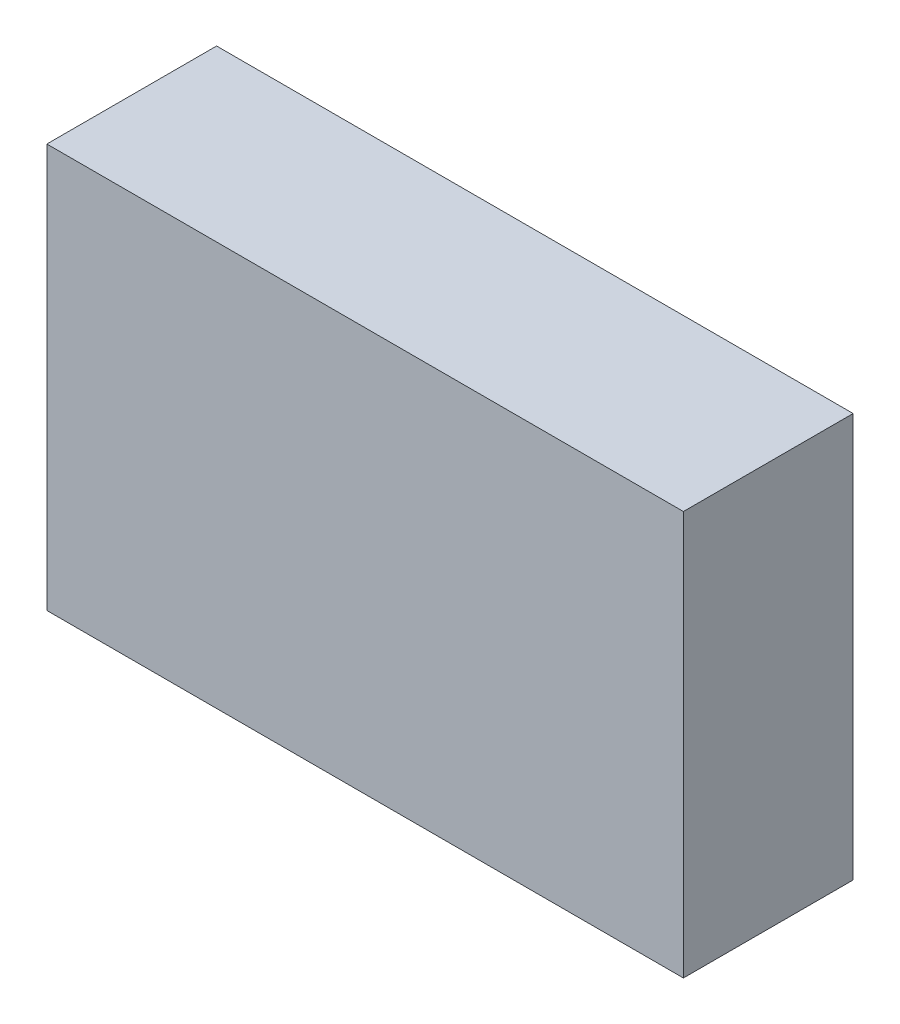
ISO-10303-21;
HEADER;
FILE_DESCRIPTION(('STEP AP214'),'2;1');
FILE_NAME('part.step','',(''),(''),'','','');
FILE_SCHEMA(('AUTOMOTIVE_DESIGN { 1 0 10303 214 1 1 1 1 }'));
ENDSEC;
DATA;
#1=APPLICATION_CONTEXT('core data for automotive mechanical design processes');
#2=APPLICATION_PROTOCOL_DEFINITION('international standard','automotive_design',2000,#1);
#3=PRODUCT_CONTEXT('',#1,'mechanical');
#4=PRODUCT('Part','Part','',(#3));
#5=PRODUCT_RELATED_PRODUCT_CATEGORY('part','',(#4));
#6=PRODUCT_DEFINITION_FORMATION('','',#4);
#7=PRODUCT_DEFINITION_CONTEXT('part definition',#1,'design');
#8=PRODUCT_DEFINITION('design','',#6,#7);
#9=PRODUCT_DEFINITION_SHAPE('','',#8);
#10=(LENGTH_UNIT() NAMED_UNIT(*) SI_UNIT(.MILLI.,.METRE.));
#11=(NAMED_UNIT(*) PLANE_ANGLE_UNIT() SI_UNIT($,.RADIAN.));
#12=(NAMED_UNIT(*) SI_UNIT($,.STERADIAN.) SOLID_ANGLE_UNIT());
#13=UNCERTAINTY_MEASURE_WITH_UNIT(LENGTH_MEASURE(1.E-05),#10,'distance_accuracy_value','');
#14=(GEOMETRIC_REPRESENTATION_CONTEXT(3) GLOBAL_UNCERTAINTY_ASSIGNED_CONTEXT((#13)) GLOBAL_UNIT_ASSIGNED_CONTEXT((#10,
#11,#12)) REPRESENTATION_CONTEXT('',''));
#15=CARTESIAN_POINT('',(0.,0.,0.));
#16=DIRECTION('',(0.,0.,1.));
#17=DIRECTION('',(1.,0.,0.));
#18=AXIS2_PLACEMENT_3D('',#15,#16,#17);
#19=CARTESIAN_POINT('',(37.5,23.8,20.));
#20=DIRECTION('',(-1.,0.,0.));
#21=DIRECTION('',(0.,0.,1.));
#22=AXIS2_PLACEMENT_3D('',#19,#20,#21);
#23=PLANE('',#22);
#24=DIRECTION('',(0.,1.,0.));
#25=VECTOR('',#24,1.);
#26=CARTESIAN_POINT('',(37.5,23.8,0.));
#27=LINE('',#26,#25);
#28=CARTESIAN_POINT('',(37.5,-23.8,0.));
#29=VERTEX_POINT('',#28);
#30=CARTESIAN_POINT('',(37.5,23.8,0.));
#31=VERTEX_POINT('',#30);
#32=EDGE_CURVE('E104',#29,#31,#27,.T.);
#33=ORIENTED_EDGE('',*,*,#32,.T.);
#34=DIRECTION('',(0.,0.,-1.));
#35=VECTOR('',#34,1.);
#36=CARTESIAN_POINT('',(37.5,23.8,20.));
#37=LINE('',#36,#35);
#38=CARTESIAN_POINT('',(37.5,23.8,20.));
#39=VERTEX_POINT('',#38);
#40=EDGE_CURVE('E11',#39,#31,#37,.T.);
#41=ORIENTED_EDGE('',*,*,#40,.F.);
#42=DIRECTION('',(0.,1.,0.));
#43=VECTOR('',#42,1.);
#44=CARTESIAN_POINT('',(37.5,23.8,20.));
#45=LINE('',#44,#43);
#46=CARTESIAN_POINT('',(37.5,-23.8,20.));
#47=VERTEX_POINT('',#46);
#48=EDGE_CURVE('E92',#47,#39,#45,.T.);
#49=ORIENTED_EDGE('',*,*,#48,.F.);
#50=DIRECTION('',(0.,0.,-1.));
#51=VECTOR('',#50,1.);
#52=CARTESIAN_POINT('',(37.5,-23.8,20.));
#53=LINE('',#52,#51);
#54=EDGE_CURVE('E100',#47,#29,#53,.T.);
#55=ORIENTED_EDGE('',*,*,#54,.T.);
#56=EDGE_LOOP('',(#33,#41,#49,#55));
#57=FACE_BOUND('',#56,.T.);
#58=ADVANCED_FACE('F41',(#57),#23,.F.);
#59=CARTESIAN_POINT('',(-37.5,23.8,20.));
#60=DIRECTION('',(0.,-1.,0.));
#61=DIRECTION('',(0.,0.,-1.));
#62=AXIS2_PLACEMENT_3D('',#59,#60,#61);
#63=PLANE('',#62);
#64=DIRECTION('',(-1.,0.,0.));
#65=VECTOR('',#64,1.);
#66=CARTESIAN_POINT('',(-37.5,23.8,0.));
#67=LINE('',#66,#65);
#68=CARTESIAN_POINT('',(-37.5,23.8,0.));
#69=VERTEX_POINT('',#68);
#70=EDGE_CURVE('E96',#31,#69,#67,.T.);
#71=ORIENTED_EDGE('',*,*,#70,.T.);
#72=DIRECTION('',(0.,0.,-1.));
#73=VECTOR('',#72,1.);
#74=CARTESIAN_POINT('',(-37.5,23.8,20.));
#75=LINE('',#74,#73);
#76=CARTESIAN_POINT('',(-37.5,23.8,20.));
#77=VERTEX_POINT('',#76);
#78=EDGE_CURVE('E49',#77,#69,#75,.T.);
#79=ORIENTED_EDGE('',*,*,#78,.F.);
#80=DIRECTION('',(-1.,0.,0.));
#81=VECTOR('',#80,1.);
#82=CARTESIAN_POINT('',(-37.5,23.8,20.));
#83=LINE('',#82,#81);
#84=EDGE_CURVE('E87',#39,#77,#83,.T.);
#85=ORIENTED_EDGE('',*,*,#84,.F.);
#86=ORIENTED_EDGE('',*,*,#40,.T.);
#87=EDGE_LOOP('',(#71,#79,#85,#86));
#88=FACE_BOUND('',#87,.T.);
#89=ADVANCED_FACE('F95',(#88),#63,.F.);
#90=CARTESIAN_POINT('',(-37.5,23.8,20.));
#91=DIRECTION('',(1.,0.,0.));
#92=DIRECTION('',(0.,0.,-1.));
#93=AXIS2_PLACEMENT_3D('',#90,#91,#92);
#94=PLANE('',#93);
#95=DIRECTION('',(0.,-1.,0.));
#96=VECTOR('',#95,1.);
#97=CARTESIAN_POINT('',(-37.5,23.8,0.));
#98=LINE('',#97,#96);
#99=CARTESIAN_POINT('',(-37.5,-23.8,0.));
#100=VERTEX_POINT('',#99);
#101=EDGE_CURVE('E74',#69,#100,#98,.T.);
#102=ORIENTED_EDGE('',*,*,#101,.T.);
#103=DIRECTION('',(0.,0.,-1.));
#104=VECTOR('',#103,1.);
#105=CARTESIAN_POINT('',(-37.5,-23.8,20.));
#106=LINE('',#105,#104);
#107=CARTESIAN_POINT('',(-37.5,-23.8,20.));
#108=VERTEX_POINT('',#107);
#109=EDGE_CURVE('E97',#108,#100,#106,.T.);
#110=ORIENTED_EDGE('',*,*,#109,.F.);
#111=DIRECTION('',(0.,-1.,0.));
#112=VECTOR('',#111,1.);
#113=CARTESIAN_POINT('',(-37.5,23.8,20.));
#114=LINE('',#113,#112);
#115=EDGE_CURVE('E90',#77,#108,#114,.T.);
#116=ORIENTED_EDGE('',*,*,#115,.F.);
#117=ORIENTED_EDGE('',*,*,#78,.T.);
#118=EDGE_LOOP('',(#102,#110,#116,#117));
#119=FACE_BOUND('',#118,.T.);
#120=ADVANCED_FACE('F98',(#119),#94,.F.);
#121=CARTESIAN_POINT('',(-37.5,-23.8,20.));
#122=DIRECTION('',(0.,1.,0.));
#123=DIRECTION('',(0.,0.,1.));
#124=AXIS2_PLACEMENT_3D('',#121,#122,#123);
#125=PLANE('',#124);
#126=DIRECTION('',(1.,0.,0.));
#127=VECTOR('',#126,1.);
#128=CARTESIAN_POINT('',(-37.5,-23.8,0.));
#129=LINE('',#128,#127);
#130=EDGE_CURVE('E80',#100,#29,#129,.T.);
#131=ORIENTED_EDGE('',*,*,#130,.T.);
#132=ORIENTED_EDGE('',*,*,#54,.F.);
#133=DIRECTION('',(1.,0.,0.));
#134=VECTOR('',#133,1.);
#135=CARTESIAN_POINT('',(-37.5,-23.8,20.));
#136=LINE('',#135,#134);
#137=EDGE_CURVE('E57',#108,#47,#136,.T.);
#138=ORIENTED_EDGE('',*,*,#137,.F.);
#139=ORIENTED_EDGE('',*,*,#109,.T.);
#140=EDGE_LOOP('',(#131,#132,#138,#139));
#141=FACE_BOUND('',#140,.T.);
#142=ADVANCED_FACE('F111',(#141),#125,.F.);
#143=CARTESIAN_POINT('',(0.,0.,20.));
#144=DIRECTION('',(0.,0.,1.));
#145=DIRECTION('',(1.,0.,0.));
#146=AXIS2_PLACEMENT_3D('',#143,#144,#145);
#147=PLANE('',#146);
#148=ORIENTED_EDGE('',*,*,#48,.T.);
#149=ORIENTED_EDGE('',*,*,#84,.T.);
#150=ORIENTED_EDGE('',*,*,#115,.T.);
#151=ORIENTED_EDGE('',*,*,#137,.T.);
#152=EDGE_LOOP('',(#148,#149,#150,#151));
#153=FACE_BOUND('',#152,.T.);
#154=ADVANCED_FACE('F88',(#153),#147,.T.);
#155=CARTESIAN_POINT('',(0.,0.,0.));
#156=DIRECTION('',(0.,0.,1.));
#157=DIRECTION('',(1.,0.,0.));
#158=AXIS2_PLACEMENT_3D('',#155,#156,#157);
#159=PLANE('',#158);
#160=ORIENTED_EDGE('',*,*,#32,.F.);
#161=ORIENTED_EDGE('',*,*,#130,.F.);
#162=ORIENTED_EDGE('',*,*,#101,.F.);
#163=ORIENTED_EDGE('',*,*,#70,.F.);
#164=EDGE_LOOP('',(#160,#161,#162,#163));
#165=FACE_BOUND('',#164,.T.);
#166=ADVANCED_FACE('F114',(#165),#159,.F.);
#167=CLOSED_SHELL('',(#58,#89,#120,#142,#154,#166));
#168=MANIFOLD_SOLID_BREP('B2',#167);
#169=ADVANCED_BREP_SHAPE_REPRESENTATION('',(#18,#168),#14);
#170=SHAPE_DEFINITION_REPRESENTATION(#9,#169);
ENDSEC;
END-ISO-10303-21;
